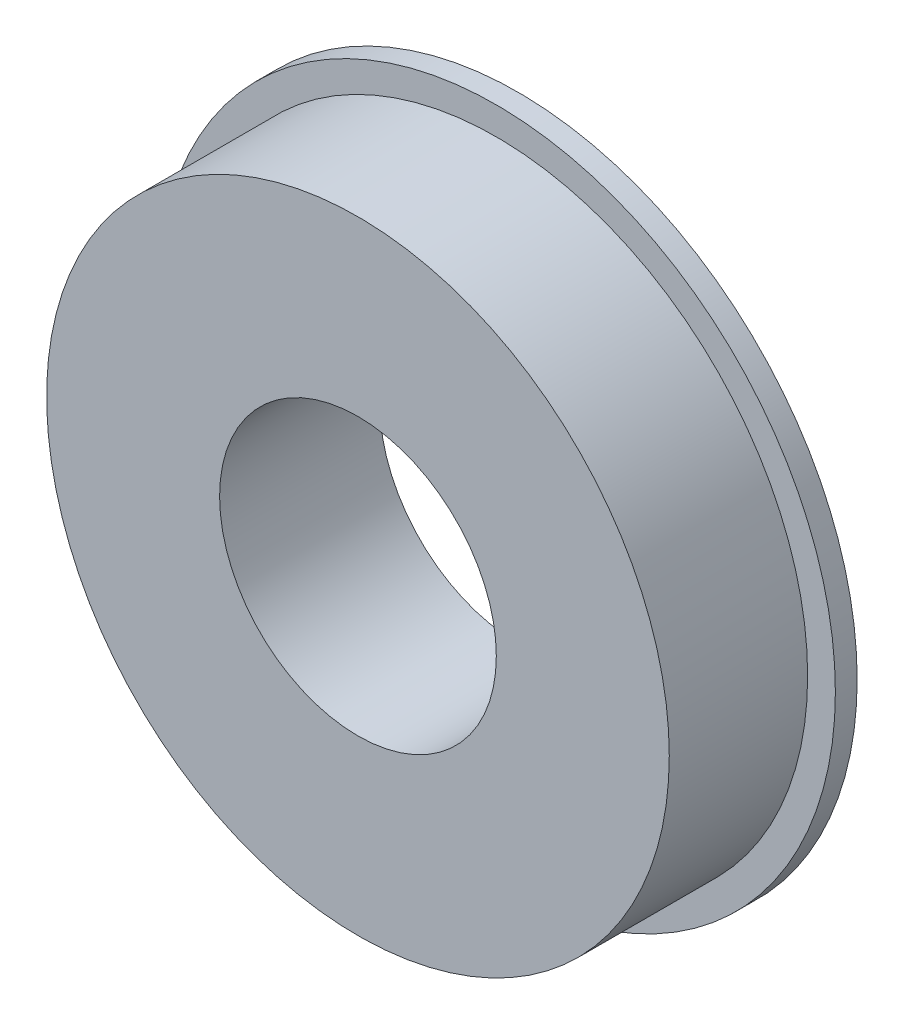
ISO-10303-21;
HEADER;
FILE_DESCRIPTION(('STEP AP214'),'2;1');
FILE_NAME('part.step','',(''),(''),'','','');
FILE_SCHEMA(('AUTOMOTIVE_DESIGN { 1 0 10303 214 1 1 1 1 }'));
ENDSEC;
DATA;
#1=APPLICATION_CONTEXT('core data for automotive mechanical design processes');
#2=APPLICATION_PROTOCOL_DEFINITION('international standard','automotive_design',2000,#1);
#3=PRODUCT_CONTEXT('',#1,'mechanical');
#4=PRODUCT('Part','Part','',(#3));
#5=PRODUCT_RELATED_PRODUCT_CATEGORY('part','',(#4));
#6=PRODUCT_DEFINITION_FORMATION('','',#4);
#7=PRODUCT_DEFINITION_CONTEXT('part definition',#1,'design');
#8=PRODUCT_DEFINITION('design','',#6,#7);
#9=PRODUCT_DEFINITION_SHAPE('','',#8);
#10=(LENGTH_UNIT() NAMED_UNIT(*) SI_UNIT(.MILLI.,.METRE.));
#11=(NAMED_UNIT(*) PLANE_ANGLE_UNIT() SI_UNIT($,.RADIAN.));
#12=(NAMED_UNIT(*) SI_UNIT($,.STERADIAN.) SOLID_ANGLE_UNIT());
#13=UNCERTAINTY_MEASURE_WITH_UNIT(LENGTH_MEASURE(1.E-05),#10,'distance_accuracy_value','');
#14=(GEOMETRIC_REPRESENTATION_CONTEXT(3) GLOBAL_UNCERTAINTY_ASSIGNED_CONTEXT((#13)) GLOBAL_UNIT_ASSIGNED_CONTEXT((#10,
#11,#12)) REPRESENTATION_CONTEXT('',''));
#15=CARTESIAN_POINT('',(0.,0.,0.));
#16=DIRECTION('',(0.,0.,1.));
#17=DIRECTION('',(1.,0.,0.));
#18=AXIS2_PLACEMENT_3D('',#15,#16,#17);
#19=CARTESIAN_POINT('',(0.,0.,7.35));
#20=DIRECTION('',(0.,0.,-1.));
#21=DIRECTION('',(-1.,0.,0.));
#22=AXIS2_PLACEMENT_3D('',#19,#20,#21);
#23=CYLINDRICAL_SURFACE('',#22,6.35);
#24=CARTESIAN_POINT('',(0.,0.,7.35));
#25=DIRECTION('',(0.,0.,1.));
#26=DIRECTION('',(1.,0.,0.));
#27=AXIS2_PLACEMENT_3D('',#24,#25,#26);
#28=CIRCLE('',#27,6.35);
#29=CARTESIAN_POINT('',(6.35,0.,7.35));
#30=VERTEX_POINT('',#29);
#31=EDGE_CURVE('E41',#30,#30,#28,.T.);
#32=ORIENTED_EDGE('',*,*,#31,.T.);
#33=EDGE_LOOP('',(#32));
#34=FACE_BOUND('',#33,.T.);
#35=CARTESIAN_POINT('',(0.,0.,0.));
#36=DIRECTION('',(0.,0.,1.));
#37=DIRECTION('',(1.,0.,0.));
#38=AXIS2_PLACEMENT_3D('',#35,#36,#37);
#39=CIRCLE('',#38,6.35);
#40=CARTESIAN_POINT('',(6.35,0.,0.));
#41=VERTEX_POINT('',#40);
#42=EDGE_CURVE('E37',#41,#41,#39,.T.);
#43=ORIENTED_EDGE('',*,*,#42,.F.);
#44=EDGE_LOOP('',(#43));
#45=FACE_BOUND('',#44,.T.);
#46=ADVANCED_FACE('F34',(#34,#45),#23,.F.);
#47=CARTESIAN_POINT('',(0.,0.,7.35));
#48=DIRECTION('',(0.,0.,-1.));
#49=DIRECTION('',(-1.,0.,0.));
#50=AXIS2_PLACEMENT_3D('',#47,#48,#49);
#51=CYLINDRICAL_SURFACE('',#50,14.2875);
#52=CARTESIAN_POINT('',(0.,0.,1.));
#53=DIRECTION('',(0.,0.,1.));
#54=DIRECTION('',(1.,0.,0.));
#55=AXIS2_PLACEMENT_3D('',#52,#53,#54);
#56=CIRCLE('',#55,14.2875);
#57=CARTESIAN_POINT('',(14.2875,0.,1.));
#58=VERTEX_POINT('',#57);
#59=EDGE_CURVE('E50',#58,#58,#56,.T.);
#60=ORIENTED_EDGE('',*,*,#59,.T.);
#61=EDGE_LOOP('',(#60));
#62=FACE_BOUND('',#61,.T.);
#63=CARTESIAN_POINT('',(0.,0.,7.35));
#64=DIRECTION('',(0.,0.,1.));
#65=DIRECTION('',(1.,0.,0.));
#66=AXIS2_PLACEMENT_3D('',#63,#64,#65);
#67=CIRCLE('',#66,14.2875);
#68=CARTESIAN_POINT('',(14.2875,0.,7.35));
#69=VERTEX_POINT('',#68);
#70=EDGE_CURVE('E10',#69,#69,#67,.T.);
#71=ORIENTED_EDGE('',*,*,#70,.F.);
#72=EDGE_LOOP('',(#71));
#73=FACE_BOUND('',#72,.T.);
#74=ADVANCED_FACE('F57',(#62,#73),#51,.T.);
#75=CARTESIAN_POINT('',(0.,0.,7.35));
#76=DIRECTION('',(0.,0.,1.));
#77=DIRECTION('',(1.,0.,0.));
#78=AXIS2_PLACEMENT_3D('',#75,#76,#77);
#79=PLANE('',#78);
#80=ORIENTED_EDGE('',*,*,#31,.F.);
#81=EDGE_LOOP('',(#80));
#82=FACE_BOUND('',#81,.T.);
#83=ORIENTED_EDGE('',*,*,#70,.T.);
#84=EDGE_LOOP('',(#83));
#85=FACE_BOUND('',#84,.T.);
#86=ADVANCED_FACE('F74',(#82,#85),#79,.T.);
#87=CARTESIAN_POINT('',(0.,0.,0.));
#88=DIRECTION('',(0.,0.,1.));
#89=DIRECTION('',(1.,0.,0.));
#90=AXIS2_PLACEMENT_3D('',#87,#88,#89);
#91=PLANE('',#90);
#92=ORIENTED_EDGE('',*,*,#42,.T.);
#93=EDGE_LOOP('',(#92));
#94=FACE_BOUND('',#93,.T.);
#95=CARTESIAN_POINT('',(0.,0.,0.));
#96=DIRECTION('',(0.,0.,1.));
#97=DIRECTION('',(1.,0.,0.));
#98=AXIS2_PLACEMENT_3D('',#95,#96,#97);
#99=CIRCLE('',#98,15.56004);
#100=CARTESIAN_POINT('',(15.56004,0.,0.));
#101=VERTEX_POINT('',#100);
#102=EDGE_CURVE('E47',#101,#101,#99,.T.);
#103=ORIENTED_EDGE('',*,*,#102,.F.);
#104=EDGE_LOOP('',(#103));
#105=FACE_BOUND('',#104,.T.);
#106=ADVANCED_FACE('F69',(#94,#105),#91,.F.);
#107=CARTESIAN_POINT('',(0.,0.,1.));
#108=DIRECTION('',(0.,0.,-1.));
#109=DIRECTION('',(-1.,0.,0.));
#110=AXIS2_PLACEMENT_3D('',#107,#108,#109);
#111=CYLINDRICAL_SURFACE('',#110,15.56004);
#112=CARTESIAN_POINT('',(0.,0.,1.));
#113=DIRECTION('',(0.,0.,1.));
#114=DIRECTION('',(1.,0.,0.));
#115=AXIS2_PLACEMENT_3D('',#112,#113,#114);
#116=CIRCLE('',#115,15.56004);
#117=CARTESIAN_POINT('',(15.56004,0.,1.));
#118=VERTEX_POINT('',#117);
#119=EDGE_CURVE('E51',#118,#118,#116,.T.);
#120=ORIENTED_EDGE('',*,*,#119,.F.);
#121=EDGE_LOOP('',(#120));
#122=FACE_BOUND('',#121,.T.);
#123=ORIENTED_EDGE('',*,*,#102,.T.);
#124=EDGE_LOOP('',(#123));
#125=FACE_BOUND('',#124,.T.);
#126=ADVANCED_FACE('F63',(#122,#125),#111,.T.);
#127=CARTESIAN_POINT('',(0.,0.,1.));
#128=DIRECTION('',(0.,0.,1.));
#129=DIRECTION('',(1.,0.,0.));
#130=AXIS2_PLACEMENT_3D('',#127,#128,#129);
#131=PLANE('',#130);
#132=ORIENTED_EDGE('',*,*,#59,.F.);
#133=EDGE_LOOP('',(#132));
#134=FACE_BOUND('',#133,.T.);
#135=ORIENTED_EDGE('',*,*,#119,.T.);
#136=EDGE_LOOP('',(#135));
#137=FACE_BOUND('',#136,.T.);
#138=ADVANCED_FACE('F60',(#134,#137),#131,.T.);
#139=CLOSED_SHELL('',(#46,#74,#86,#106,#126,#138));
#140=MANIFOLD_SOLID_BREP('B2',#139);
#141=ADVANCED_BREP_SHAPE_REPRESENTATION('',(#18,#140),#14);
#142=SHAPE_DEFINITION_REPRESENTATION(#9,#141);
ENDSEC;
END-ISO-10303-21;
